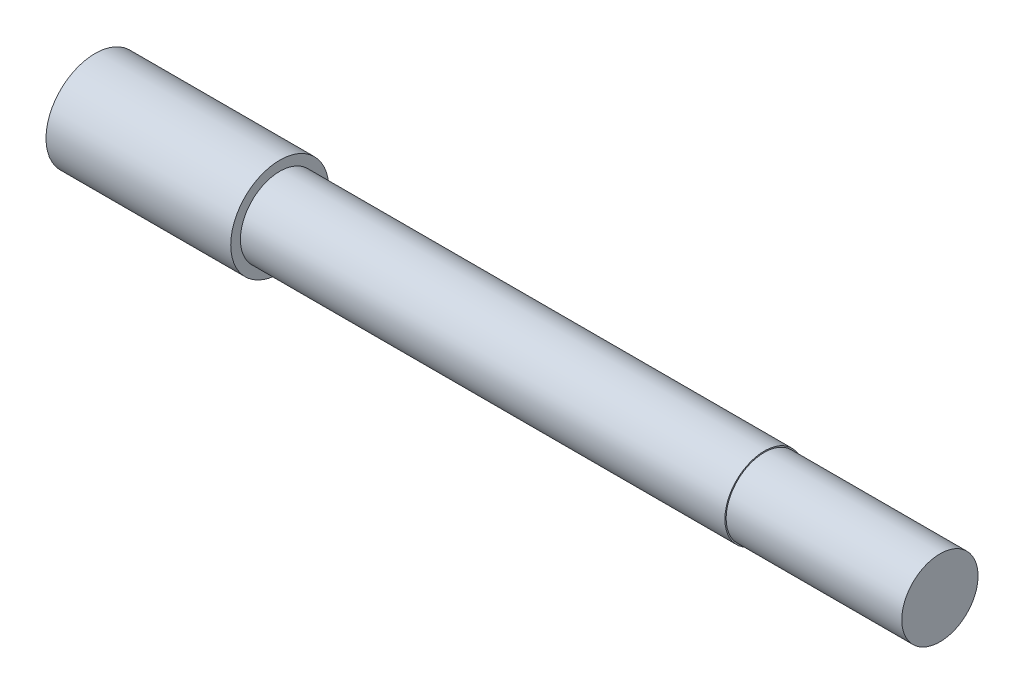
ISO-10303-21;
HEADER;
FILE_DESCRIPTION(('STEP AP214'),'2;1');
FILE_NAME('part.step','',(''),(''),'','','');
FILE_SCHEMA(('AUTOMOTIVE_DESIGN { 1 0 10303 214 1 1 1 1 }'));
ENDSEC;
DATA;
#1=APPLICATION_CONTEXT('core data for automotive mechanical design processes');
#2=APPLICATION_PROTOCOL_DEFINITION('international standard','automotive_design',2000,#1);
#3=PRODUCT_CONTEXT('',#1,'mechanical');
#4=PRODUCT('Part','Part','',(#3));
#5=PRODUCT_RELATED_PRODUCT_CATEGORY('part','',(#4));
#6=PRODUCT_DEFINITION_FORMATION('','',#4);
#7=PRODUCT_DEFINITION_CONTEXT('part definition',#1,'design');
#8=PRODUCT_DEFINITION('design','',#6,#7);
#9=PRODUCT_DEFINITION_SHAPE('','',#8);
#10=(LENGTH_UNIT() NAMED_UNIT(*) SI_UNIT(.MILLI.,.METRE.));
#11=(NAMED_UNIT(*) PLANE_ANGLE_UNIT() SI_UNIT($,.RADIAN.));
#12=(NAMED_UNIT(*) SI_UNIT($,.STERADIAN.) SOLID_ANGLE_UNIT());
#13=UNCERTAINTY_MEASURE_WITH_UNIT(LENGTH_MEASURE(1.E-05),#10,'distance_accuracy_value','');
#14=(GEOMETRIC_REPRESENTATION_CONTEXT(3) GLOBAL_UNCERTAINTY_ASSIGNED_CONTEXT((#13)) GLOBAL_UNIT_ASSIGNED_CONTEXT((#10,
#11,#12)) REPRESENTATION_CONTEXT('',''));
#15=CARTESIAN_POINT('',(0.,0.,0.));
#16=DIRECTION('',(0.,0.,1.));
#17=DIRECTION('',(1.,0.,0.));
#18=AXIS2_PLACEMENT_3D('',#15,#16,#17);
#19=CARTESIAN_POINT('',(0.,0.,0.));
#20=DIRECTION('',(1.,0.,0.));
#21=DIRECTION('',(0.,0.,-1.));
#22=AXIS2_PLACEMENT_3D('',#19,#20,#21);
#23=PLANE('',#22);
#24=CARTESIAN_POINT('',(0.,0.,0.));
#25=DIRECTION('',(-1.,0.,0.));
#26=DIRECTION('',(0.,0.,1.));
#27=AXIS2_PLACEMENT_3D('',#24,#25,#26);
#28=CIRCLE('',#27,8.1);
#29=CARTESIAN_POINT('',(0.,0.,8.10000000000002));
#30=VERTEX_POINT('',#29);
#31=EDGE_CURVE('E12',#30,#30,#28,.T.);
#32=ORIENTED_EDGE('',*,*,#31,.T.);
#33=EDGE_LOOP('',(#32));
#34=FACE_BOUND('',#33,.T.);
#35=ADVANCED_FACE('F44',(#34),#23,.F.);
#36=CARTESIAN_POINT('',(0.,0.,0.));
#37=DIRECTION('',(-1.,0.,0.));
#38=DIRECTION('',(0.,0.,1.));
#39=AXIS2_PLACEMENT_3D('',#36,#37,#38);
#40=CYLINDRICAL_SURFACE('',#39,8.1);
#41=ORIENTED_EDGE('',*,*,#31,.F.);
#42=EDGE_LOOP('',(#41));
#43=FACE_BOUND('',#42,.T.);
#44=CARTESIAN_POINT('',(30.5,0.,0.));
#45=DIRECTION('',(-1.,0.,0.));
#46=DIRECTION('',(0.,0.,1.));
#47=AXIS2_PLACEMENT_3D('',#44,#45,#46);
#48=CIRCLE('',#47,8.1);
#49=CARTESIAN_POINT('',(30.5,0.,8.10000000000002));
#50=VERTEX_POINT('',#49);
#51=EDGE_CURVE('E51',#50,#50,#48,.T.);
#52=ORIENTED_EDGE('',*,*,#51,.T.);
#53=EDGE_LOOP('',(#52));
#54=FACE_BOUND('',#53,.T.);
#55=ADVANCED_FACE('F91',(#43,#54),#40,.T.);
#56=CARTESIAN_POINT('',(30.5,8.10000000000001,0.));
#57=DIRECTION('',(-1.,0.,0.));
#58=DIRECTION('',(0.,0.,1.));
#59=AXIS2_PLACEMENT_3D('',#56,#57,#58);
#60=PLANE('',#59);
#61=ORIENTED_EDGE('',*,*,#51,.F.);
#62=EDGE_LOOP('',(#61));
#63=FACE_BOUND('',#62,.T.);
#64=CARTESIAN_POINT('',(30.5,0.,0.));
#65=DIRECTION('',(-1.,0.,0.));
#66=DIRECTION('',(0.,0.,1.));
#67=AXIS2_PLACEMENT_3D('',#64,#65,#66);
#68=CIRCLE('',#67,6.5);
#69=CARTESIAN_POINT('',(30.5,0.,6.50000000000002));
#70=VERTEX_POINT('',#69);
#71=EDGE_CURVE('E57',#70,#70,#68,.T.);
#72=ORIENTED_EDGE('',*,*,#71,.T.);
#73=EDGE_LOOP('',(#72));
#74=FACE_BOUND('',#73,.T.);
#75=ADVANCED_FACE('F95',(#63,#74),#60,.F.);
#76=CARTESIAN_POINT('',(0.,0.,0.));
#77=DIRECTION('',(-1.,0.,0.));
#78=DIRECTION('',(0.,0.,1.));
#79=AXIS2_PLACEMENT_3D('',#76,#77,#78);
#80=CYLINDRICAL_SURFACE('',#79,6.5);
#81=ORIENTED_EDGE('',*,*,#71,.F.);
#82=EDGE_LOOP('',(#81));
#83=FACE_BOUND('',#82,.T.);
#84=CARTESIAN_POINT('',(110.5,0.,0.));
#85=DIRECTION('',(-1.,0.,0.));
#86=DIRECTION('',(0.,0.,1.));
#87=AXIS2_PLACEMENT_3D('',#84,#85,#86);
#88=CIRCLE('',#87,6.5);
#89=CARTESIAN_POINT('',(110.5,0.,6.50000000000002));
#90=VERTEX_POINT('',#89);
#91=EDGE_CURVE('E63',#90,#90,#88,.T.);
#92=ORIENTED_EDGE('',*,*,#91,.T.);
#93=EDGE_LOOP('',(#92));
#94=FACE_BOUND('',#93,.T.);
#95=ADVANCED_FACE('F100',(#83,#94),#80,.T.);
#96=CARTESIAN_POINT('',(110.5,6.50000000000002,0.));
#97=DIRECTION('',(-1.,0.,0.));
#98=DIRECTION('',(0.,0.,1.));
#99=AXIS2_PLACEMENT_3D('',#96,#97,#98);
#100=PLANE('',#99);
#101=ORIENTED_EDGE('',*,*,#91,.F.);
#102=EDGE_LOOP('',(#101));
#103=FACE_BOUND('',#102,.T.);
#104=CARTESIAN_POINT('',(110.5,0.,0.));
#105=DIRECTION('',(-1.,0.,0.));
#106=DIRECTION('',(0.,0.,1.));
#107=AXIS2_PLACEMENT_3D('',#104,#105,#106);
#108=CIRCLE('',#107,6.3);
#109=CARTESIAN_POINT('',(110.5,0.,6.30000000000002));
#110=VERTEX_POINT('',#109);
#111=EDGE_CURVE('E69',#110,#110,#108,.T.);
#112=ORIENTED_EDGE('',*,*,#111,.T.);
#113=EDGE_LOOP('',(#112));
#114=FACE_BOUND('',#113,.T.);
#115=ADVANCED_FACE('F87',(#103,#114),#100,.F.);
#116=CARTESIAN_POINT('',(0.,0.,0.));
#117=DIRECTION('',(-1.,0.,0.));
#118=DIRECTION('',(0.,0.,1.));
#119=AXIS2_PLACEMENT_3D('',#116,#117,#118);
#120=CYLINDRICAL_SURFACE('',#119,6.3);
#121=ORIENTED_EDGE('',*,*,#111,.F.);
#122=EDGE_LOOP('',(#121));
#123=FACE_BOUND('',#122,.T.);
#124=CARTESIAN_POINT('',(139.5,0.,0.));
#125=DIRECTION('',(-1.,0.,0.));
#126=DIRECTION('',(0.,0.,1.));
#127=AXIS2_PLACEMENT_3D('',#124,#125,#126);
#128=CIRCLE('',#127,6.3);
#129=CARTESIAN_POINT('',(139.5,0.,6.30000000000002));
#130=VERTEX_POINT('',#129);
#131=EDGE_CURVE('E73',#130,#130,#128,.T.);
#132=ORIENTED_EDGE('',*,*,#131,.T.);
#133=EDGE_LOOP('',(#132));
#134=FACE_BOUND('',#133,.T.);
#135=ADVANCED_FACE('F79',(#123,#134),#120,.T.);
#136=CARTESIAN_POINT('',(139.5,6.30000000000001,0.));
#137=DIRECTION('',(-1.,0.,0.));
#138=DIRECTION('',(0.,0.,1.));
#139=AXIS2_PLACEMENT_3D('',#136,#137,#138);
#140=PLANE('',#139);
#141=ORIENTED_EDGE('',*,*,#131,.F.);
#142=EDGE_LOOP('',(#141));
#143=FACE_BOUND('',#142,.T.);
#144=ADVANCED_FACE('F81',(#143),#140,.F.);
#145=CLOSED_SHELL('',(#35,#55,#75,#95,#115,#135,#144));
#146=MANIFOLD_SOLID_BREP('B2',#145);
#147=ADVANCED_BREP_SHAPE_REPRESENTATION('',(#18,#146),#14);
#148=SHAPE_DEFINITION_REPRESENTATION(#9,#147);
ENDSEC;
END-ISO-10303-21;
